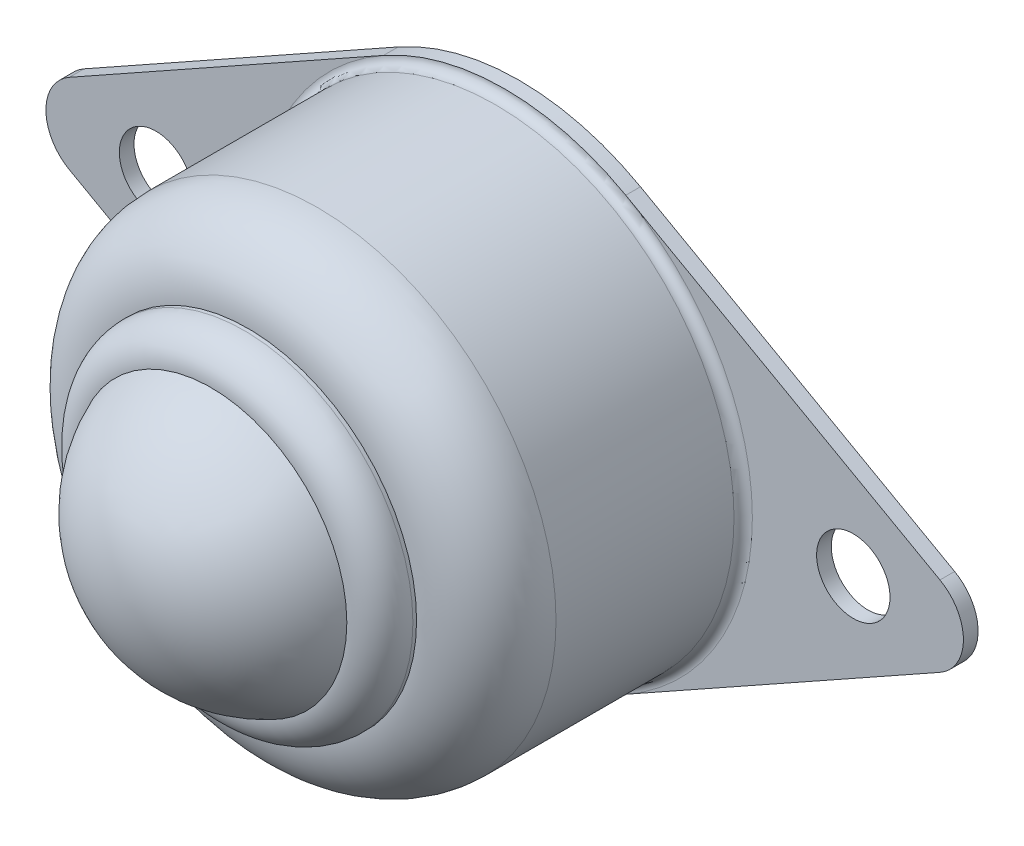
ISO-10303-21;
HEADER;
FILE_DESCRIPTION(('STEP AP214'),'2;1');
FILE_NAME('part.step','',(''),(''),'','','');
FILE_SCHEMA(('AUTOMOTIVE_DESIGN { 1 0 10303 214 1 1 1 1 }'));
ENDSEC;
DATA;
#1=APPLICATION_CONTEXT('core data for automotive mechanical design processes');
#2=APPLICATION_PROTOCOL_DEFINITION('international standard','automotive_design',2000,#1);
#3=PRODUCT_CONTEXT('',#1,'mechanical');
#4=PRODUCT('Part','Part','',(#3));
#5=PRODUCT_RELATED_PRODUCT_CATEGORY('part','',(#4));
#6=PRODUCT_DEFINITION_FORMATION('','',#4);
#7=PRODUCT_DEFINITION_CONTEXT('part definition',#1,'design');
#8=PRODUCT_DEFINITION('design','',#6,#7);
#9=PRODUCT_DEFINITION_SHAPE('','',#8);
#10=(LENGTH_UNIT() NAMED_UNIT(*) SI_UNIT(.MILLI.,.METRE.));
#11=(NAMED_UNIT(*) PLANE_ANGLE_UNIT() SI_UNIT($,.RADIAN.));
#12=(NAMED_UNIT(*) SI_UNIT($,.STERADIAN.) SOLID_ANGLE_UNIT());
#13=UNCERTAINTY_MEASURE_WITH_UNIT(LENGTH_MEASURE(1.E-05),#10,'distance_accuracy_value','');
#14=(GEOMETRIC_REPRESENTATION_CONTEXT(3) GLOBAL_UNCERTAINTY_ASSIGNED_CONTEXT((#13)) GLOBAL_UNIT_ASSIGNED_CONTEXT((#10,
#11,#12)) REPRESENTATION_CONTEXT('',''));
#15=CARTESIAN_POINT('',(0.,0.,0.));
#16=DIRECTION('',(0.,0.,1.));
#17=DIRECTION('',(1.,0.,0.));
#18=AXIS2_PLACEMENT_3D('',#15,#16,#17);
#19=CARTESIAN_POINT('',(0.,0.,1.3));
#20=DIRECTION('',(0.,0.,1.));
#21=DIRECTION('',(1.,0.,0.));
#22=AXIS2_PLACEMENT_3D('',#19,#20,#21);
#23=TOROIDAL_SURFACE('',#22,13.5,0.5);
#24=CARTESIAN_POINT('',(0.,0.,0.8));
#25=DIRECTION('',(0.,0.,1.));
#26=DIRECTION('',(1.,0.,0.));
#27=AXIS2_PLACEMENT_3D('',#24,#25,#26);
#28=CIRCLE('',#27,13.5);
#29=CARTESIAN_POINT('',(6.6,11.7766718558343,0.8));
#30=VERTEX_POINT('',#29);
#31=CARTESIAN_POINT('',(6.6,-11.7766718558343,0.8));
#32=VERTEX_POINT('',#31);
#33=EDGE_CURVE('E42',#30,#32,#28,.F.);
#34=ORIENTED_EDGE('',*,*,#33,.F.);
#35=CARTESIAN_POINT('',(0.,0.,0.8));
#36=DIRECTION('',(0.,0.,1.));
#37=DIRECTION('',(1.,0.,0.));
#38=AXIS2_PLACEMENT_3D('',#35,#36,#37);
#39=CIRCLE('',#38,13.5);
#40=CARTESIAN_POINT('',(-6.6,11.7766718558343,0.8));
#41=VERTEX_POINT('',#40);
#42=EDGE_CURVE('E113',#30,#41,#39,.T.);
#43=ORIENTED_EDGE('',*,*,#42,.T.);
#44=CARTESIAN_POINT('',(0.,0.,0.8));
#45=DIRECTION('',(0.,0.,1.));
#46=DIRECTION('',(1.,0.,0.));
#47=AXIS2_PLACEMENT_3D('',#44,#45,#46);
#48=CIRCLE('',#47,13.5);
#49=CARTESIAN_POINT('',(-6.60000000000001,-11.7766718558343,0.8));
#50=VERTEX_POINT('',#49);
#51=EDGE_CURVE('E118',#50,#41,#48,.F.);
#52=ORIENTED_EDGE('',*,*,#51,.F.);
#53=CARTESIAN_POINT('',(0.,0.,0.8));
#54=DIRECTION('',(0.,0.,1.));
#55=DIRECTION('',(1.,0.,0.));
#56=AXIS2_PLACEMENT_3D('',#53,#54,#55);
#57=CIRCLE('',#56,13.5);
#58=EDGE_CURVE('E115',#50,#32,#57,.T.);
#59=ORIENTED_EDGE('',*,*,#58,.T.);
#60=EDGE_LOOP('',(#34,#43,#52,#59));
#61=FACE_BOUND('',#60,.T.);
#62=CARTESIAN_POINT('',(0.,0.,1.3));
#63=DIRECTION('',(0.,0.,1.));
#64=DIRECTION('',(1.,0.,0.));
#65=AXIS2_PLACEMENT_3D('',#62,#63,#64);
#66=CIRCLE('',#65,13.);
#67=CARTESIAN_POINT('',(13.,0.,1.3));
#68=VERTEX_POINT('',#67);
#69=EDGE_CURVE('E11',#68,#68,#66,.T.);
#70=ORIENTED_EDGE('',*,*,#69,.F.);
#71=EDGE_LOOP('',(#70));
#72=FACE_BOUND('',#71,.T.);
#73=ADVANCED_FACE('F34',(#61,#72),#23,.F.);
#74=CARTESIAN_POINT('',(-22.5,0.,0.8));
#75=DIRECTION('',(0.,0.,1.));
#76=DIRECTION('',(1.,0.,0.));
#77=AXIS2_PLACEMENT_3D('',#74,#75,#76);
#78=PLANE('',#77);
#79=CARTESIAN_POINT('',(19.,0.,0.8));
#80=DIRECTION('',(0.,0.,1.));
#81=DIRECTION('',(1.,0.,0.));
#82=AXIS2_PLACEMENT_3D('',#79,#80,#81);
#83=CIRCLE('',#82,2.);
#84=CARTESIAN_POINT('',(21.,0.,0.799999999999999));
#85=VERTEX_POINT('',#84);
#86=EDGE_CURVE('E179',#85,#85,#83,.T.);
#87=ORIENTED_EDGE('',*,*,#86,.F.);
#88=EDGE_LOOP('',(#87));
#89=FACE_BOUND('',#88,.T.);
#90=DIRECTION('',(-0.872346063395134,0.488888888888889,0.));
#91=VECTOR('',#90,1.);
#92=CARTESIAN_POINT('',(23.7222222222222,2.18086515848784,0.8));
#93=LINE('',#92,#91);
#94=CARTESIAN_POINT('',(23.7222222222222,2.18086515848784,0.8));
#95=VERTEX_POINT('',#94);
#96=EDGE_CURVE('E120',#95,#30,#93,.T.);
#97=ORIENTED_EDGE('',*,*,#96,.T.);
#98=ORIENTED_EDGE('',*,*,#33,.T.);
#99=DIRECTION('',(0.872346063395134,0.488888888888889,0.));
#100=VECTOR('',#99,1.);
#101=CARTESIAN_POINT('',(23.7222222222222,-2.18086515848784,0.8));
#102=LINE('',#101,#100);
#103=CARTESIAN_POINT('',(23.7222222222222,-2.18086515848784,0.8));
#104=VERTEX_POINT('',#103);
#105=EDGE_CURVE('E200',#32,#104,#102,.T.);
#106=ORIENTED_EDGE('',*,*,#105,.T.);
#107=CARTESIAN_POINT('',(22.5,0.,0.8));
#108=DIRECTION('',(0.,0.,1.));
#109=DIRECTION('',(1.,0.,0.));
#110=AXIS2_PLACEMENT_3D('',#107,#108,#109);
#111=CIRCLE('',#110,2.5);
#112=EDGE_CURVE('E124',#104,#95,#111,.T.);
#113=ORIENTED_EDGE('',*,*,#112,.T.);
#114=EDGE_LOOP('',(#97,#98,#106,#113));
#115=FACE_BOUND('',#114,.T.);
#116=ADVANCED_FACE('F122',(#89,#115),#78,.T.);
#117=CARTESIAN_POINT('',(0.,0.,15.));
#118=DIRECTION('',(0.,0.,1.));
#119=DIRECTION('',(1.,0.,0.));
#120=AXIS2_PLACEMENT_3D('',#117,#118,#119);
#121=TOROIDAL_SURFACE('',#120,7.4,1.8);
#122=CARTESIAN_POINT('',(0.,0.,16.8));
#123=DIRECTION('',(0.,0.,1.));
#124=DIRECTION('',(1.,0.,0.));
#125=AXIS2_PLACEMENT_3D('',#122,#123,#124);
#126=CIRCLE('',#125,7.4);
#127=CARTESIAN_POINT('',(7.4,0.,16.8));
#128=VERTEX_POINT('',#127);
#129=EDGE_CURVE('E185',#128,#128,#126,.T.);
#130=ORIENTED_EDGE('',*,*,#129,.F.);
#131=EDGE_LOOP('',(#130));
#132=FACE_BOUND('',#131,.T.);
#133=CARTESIAN_POINT('',(0.,0.,15.));
#134=DIRECTION('',(0.,0.,1.));
#135=DIRECTION('',(1.,0.,0.));
#136=AXIS2_PLACEMENT_3D('',#133,#134,#135);
#137=CIRCLE('',#136,9.2);
#138=CARTESIAN_POINT('',(9.2,0.,15.));
#139=VERTEX_POINT('',#138);
#140=EDGE_CURVE('E186',#139,#139,#137,.F.);
#141=ORIENTED_EDGE('',*,*,#140,.F.);
#142=EDGE_LOOP('',(#141));
#143=FACE_BOUND('',#142,.T.);
#144=ADVANCED_FACE('F214',(#132,#143),#121,.T.);
#145=CARTESIAN_POINT('',(0.,0.,11.));
#146=DIRECTION('',(0.,0.,1.));
#147=DIRECTION('',(1.,0.,0.));
#148=AXIS2_PLACEMENT_3D('',#145,#146,#147);
#149=TOROIDAL_SURFACE('',#148,9.2,3.8);
#150=CARTESIAN_POINT('',(0.,0.,14.8));
#151=DIRECTION('',(0.,0.,1.));
#152=DIRECTION('',(1.,0.,0.));
#153=AXIS2_PLACEMENT_3D('',#150,#151,#152);
#154=CIRCLE('',#153,9.2);
#155=CARTESIAN_POINT('',(9.2,0.,14.8));
#156=VERTEX_POINT('',#155);
#157=EDGE_CURVE('E172',#156,#156,#154,.T.);
#158=ORIENTED_EDGE('',*,*,#157,.F.);
#159=EDGE_LOOP('',(#158));
#160=FACE_BOUND('',#159,.T.);
#161=CARTESIAN_POINT('',(0.,0.,11.));
#162=DIRECTION('',(0.,0.,1.));
#163=DIRECTION('',(1.,0.,0.));
#164=AXIS2_PLACEMENT_3D('',#161,#162,#163);
#165=CIRCLE('',#164,13.);
#166=CARTESIAN_POINT('',(13.,0.,11.));
#167=VERTEX_POINT('',#166);
#168=EDGE_CURVE('E182',#167,#167,#165,.F.);
#169=ORIENTED_EDGE('',*,*,#168,.F.);
#170=EDGE_LOOP('',(#169));
#171=FACE_BOUND('',#170,.T.);
#172=ADVANCED_FACE('F221',(#160,#171),#149,.T.);
#173=CARTESIAN_POINT('',(-22.5,0.,0.8));
#174=DIRECTION('',(0.,0.,-1.));
#175=DIRECTION('',(-1.,0.,0.));
#176=AXIS2_PLACEMENT_3D('',#173,#174,#175);
#177=CYLINDRICAL_SURFACE('',#176,2.5);
#178=CARTESIAN_POINT('',(-22.5,0.,0.));
#179=DIRECTION('',(0.,0.,1.));
#180=DIRECTION('',(1.,0.,0.));
#181=AXIS2_PLACEMENT_3D('',#178,#179,#180);
#182=CIRCLE('',#181,2.5);
#183=CARTESIAN_POINT('',(-23.7222222222222,2.18086515848784,0.));
#184=VERTEX_POINT('',#183);
#185=CARTESIAN_POINT('',(-23.7222222222222,-2.18086515848783,0.));
#186=VERTEX_POINT('',#185);
#187=EDGE_CURVE('E142',#184,#186,#182,.T.);
#188=ORIENTED_EDGE('',*,*,#187,.T.);
#189=DIRECTION('',(0.,0.,-1.));
#190=VECTOR('',#189,1.);
#191=CARTESIAN_POINT('',(-23.7222222222222,-2.18086515848783,0.8));
#192=LINE('',#191,#190);
#193=CARTESIAN_POINT('',(-23.7222222222222,-2.18086515848783,0.8));
#194=VERTEX_POINT('',#193);
#195=EDGE_CURVE('E170',#194,#186,#192,.T.);
#196=ORIENTED_EDGE('',*,*,#195,.F.);
#197=CARTESIAN_POINT('',(-22.5,0.,0.8));
#198=DIRECTION('',(0.,0.,1.));
#199=DIRECTION('',(1.,0.,0.));
#200=AXIS2_PLACEMENT_3D('',#197,#198,#199);
#201=CIRCLE('',#200,2.5);
#202=CARTESIAN_POINT('',(-23.7222222222222,2.18086515848784,0.8));
#203=VERTEX_POINT('',#202);
#204=EDGE_CURVE('E157',#203,#194,#201,.T.);
#205=ORIENTED_EDGE('',*,*,#204,.F.);
#206=DIRECTION('',(0.,0.,-1.));
#207=VECTOR('',#206,1.);
#208=CARTESIAN_POINT('',(-23.7222222222222,2.18086515848784,0.8));
#209=LINE('',#208,#207);
#210=EDGE_CURVE('E138',#203,#184,#209,.T.);
#211=ORIENTED_EDGE('',*,*,#210,.T.);
#212=EDGE_LOOP('',(#188,#196,#205,#211));
#213=FACE_BOUND('',#212,.T.);
#214=ADVANCED_FACE('F247',(#213),#177,.T.);
#215=CARTESIAN_POINT('',(-23.7222222222222,-2.18086515848783,0.8));
#216=DIRECTION('',(0.488888888888889,0.872346063395134,0.));
#217=DIRECTION('',(-0.872346063395134,0.488888888888889,0.));
#218=AXIS2_PLACEMENT_3D('',#215,#216,#217);
#219=PLANE('',#218);
#220=DIRECTION('',(0.872346063395134,-0.488888888888889,0.));
#221=VECTOR('',#220,1.);
#222=CARTESIAN_POINT('',(-23.7222222222222,-2.18086515848783,0.));
#223=LINE('',#222,#221);
#224=CARTESIAN_POINT('',(-6.60000000000001,-11.7766718558343,0.));
#225=VERTEX_POINT('',#224);
#226=EDGE_CURVE('E145',#186,#225,#223,.T.);
#227=ORIENTED_EDGE('',*,*,#226,.T.);
#228=DIRECTION('',(0.,0.,-1.));
#229=VECTOR('',#228,1.);
#230=CARTESIAN_POINT('',(-6.60000000000001,-11.7766718558343,0.8));
#231=LINE('',#230,#229);
#232=EDGE_CURVE('E167',#50,#225,#231,.T.);
#233=ORIENTED_EDGE('',*,*,#232,.F.);
#234=DIRECTION('',(0.872346063395134,-0.488888888888889,0.));
#235=VECTOR('',#234,1.);
#236=CARTESIAN_POINT('',(-23.7222222222222,-2.18086515848783,0.8));
#237=LINE('',#236,#235);
#238=EDGE_CURVE('E94',#194,#50,#237,.T.);
#239=ORIENTED_EDGE('',*,*,#238,.F.);
#240=ORIENTED_EDGE('',*,*,#195,.T.);
#241=EDGE_LOOP('',(#227,#233,#239,#240));
#242=FACE_BOUND('',#241,.T.);
#243=ADVANCED_FACE('F195',(#242),#219,.F.);
#244=CARTESIAN_POINT('',(0.,0.,0.8));
#245=DIRECTION('',(0.,0.,-1.));
#246=DIRECTION('',(-1.,0.,0.));
#247=AXIS2_PLACEMENT_3D('',#244,#245,#246);
#248=CYLINDRICAL_SURFACE('',#247,13.5);
#249=CARTESIAN_POINT('',(0.,0.,0.));
#250=DIRECTION('',(0.,0.,1.));
#251=DIRECTION('',(1.,0.,0.));
#252=AXIS2_PLACEMENT_3D('',#249,#250,#251);
#253=CIRCLE('',#252,13.5);
#254=CARTESIAN_POINT('',(6.6,-11.7766718558343,0.));
#255=VERTEX_POINT('',#254);
#256=EDGE_CURVE('E148',#225,#255,#253,.T.);
#257=ORIENTED_EDGE('',*,*,#256,.T.);
#258=DIRECTION('',(0.,0.,-1.));
#259=VECTOR('',#258,1.);
#260=CARTESIAN_POINT('',(6.6,-11.7766718558343,0.8));
#261=LINE('',#260,#259);
#262=EDGE_CURVE('E164',#32,#255,#261,.T.);
#263=ORIENTED_EDGE('',*,*,#262,.F.);
#264=ORIENTED_EDGE('',*,*,#58,.F.);
#265=ORIENTED_EDGE('',*,*,#232,.T.);
#266=EDGE_LOOP('',(#257,#263,#264,#265));
#267=FACE_BOUND('',#266,.T.);
#268=ADVANCED_FACE('F198',(#267),#248,.T.);
#269=CARTESIAN_POINT('',(23.7222222222222,-2.18086515848784,0.8));
#270=DIRECTION('',(-0.488888888888889,0.872346063395134,0.));
#271=DIRECTION('',(-0.872346063395134,-0.488888888888889,0.));
#272=AXIS2_PLACEMENT_3D('',#269,#270,#271);
#273=PLANE('',#272);
#274=DIRECTION('',(0.872346063395134,0.488888888888889,0.));
#275=VECTOR('',#274,1.);
#276=CARTESIAN_POINT('',(23.7222222222222,-2.18086515848784,0.));
#277=LINE('',#276,#275);
#278=CARTESIAN_POINT('',(23.7222222222222,-2.18086515848784,0.));
#279=VERTEX_POINT('',#278);
#280=EDGE_CURVE('E150',#255,#279,#277,.T.);
#281=ORIENTED_EDGE('',*,*,#280,.T.);
#282=DIRECTION('',(0.,0.,-1.));
#283=VECTOR('',#282,1.);
#284=CARTESIAN_POINT('',(23.7222222222222,-2.18086515848784,0.8));
#285=LINE('',#284,#283);
#286=EDGE_CURVE('E161',#104,#279,#285,.T.);
#287=ORIENTED_EDGE('',*,*,#286,.F.);
#288=ORIENTED_EDGE('',*,*,#105,.F.);
#289=ORIENTED_EDGE('',*,*,#262,.T.);
#290=EDGE_LOOP('',(#281,#287,#288,#289));
#291=FACE_BOUND('',#290,.T.);
#292=ADVANCED_FACE('F365',(#291),#273,.F.);
#293=CARTESIAN_POINT('',(22.5,0.,0.8));
#294=DIRECTION('',(0.,0.,-1.));
#295=DIRECTION('',(-1.,0.,0.));
#296=AXIS2_PLACEMENT_3D('',#293,#294,#295);
#297=CYLINDRICAL_SURFACE('',#296,2.5);
#298=CARTESIAN_POINT('',(22.5,0.,0.));
#299=DIRECTION('',(0.,0.,1.));
#300=DIRECTION('',(1.,0.,0.));
#301=AXIS2_PLACEMENT_3D('',#298,#299,#300);
#302=CIRCLE('',#301,2.5);
#303=CARTESIAN_POINT('',(23.7222222222222,2.18086515848784,0.));
#304=VERTEX_POINT('',#303);
#305=EDGE_CURVE('E152',#279,#304,#302,.T.);
#306=ORIENTED_EDGE('',*,*,#305,.T.);
#307=DIRECTION('',(0.,0.,-1.));
#308=VECTOR('',#307,1.);
#309=CARTESIAN_POINT('',(23.7222222222222,2.18086515848784,0.8));
#310=LINE('',#309,#308);
#311=EDGE_CURVE('E133',#95,#304,#310,.T.);
#312=ORIENTED_EDGE('',*,*,#311,.F.);
#313=ORIENTED_EDGE('',*,*,#112,.F.);
#314=ORIENTED_EDGE('',*,*,#286,.T.);
#315=EDGE_LOOP('',(#306,#312,#313,#314));
#316=FACE_BOUND('',#315,.T.);
#317=ADVANCED_FACE('F357',(#316),#297,.T.);
#318=CARTESIAN_POINT('',(23.7222222222222,2.18086515848784,0.8));
#319=DIRECTION('',(-0.488888888888889,-0.872346063395134,0.));
#320=DIRECTION('',(0.872346063395134,-0.488888888888889,0.));
#321=AXIS2_PLACEMENT_3D('',#318,#319,#320);
#322=PLANE('',#321);
#323=DIRECTION('',(-0.872346063395134,0.488888888888889,0.));
#324=VECTOR('',#323,1.);
#325=CARTESIAN_POINT('',(23.7222222222222,2.18086515848784,0.));
#326=LINE('',#325,#324);
#327=CARTESIAN_POINT('',(6.6,11.7766718558343,0.));
#328=VERTEX_POINT('',#327);
#329=EDGE_CURVE('E132',#304,#328,#326,.T.);
#330=ORIENTED_EDGE('',*,*,#329,.T.);
#331=DIRECTION('',(0.,0.,-1.));
#332=VECTOR('',#331,1.);
#333=CARTESIAN_POINT('',(6.6,11.7766718558343,0.8));
#334=LINE('',#333,#332);
#335=EDGE_CURVE('E129',#30,#328,#334,.T.);
#336=ORIENTED_EDGE('',*,*,#335,.F.);
#337=ORIENTED_EDGE('',*,*,#96,.F.);
#338=ORIENTED_EDGE('',*,*,#311,.T.);
#339=EDGE_LOOP('',(#330,#336,#337,#338));
#340=FACE_BOUND('',#339,.T.);
#341=ADVANCED_FACE('F130',(#340),#322,.F.);
#342=CARTESIAN_POINT('',(0.,0.,0.8));
#343=DIRECTION('',(0.,0.,-1.));
#344=DIRECTION('',(-1.,0.,0.));
#345=AXIS2_PLACEMENT_3D('',#342,#343,#344);
#346=CYLINDRICAL_SURFACE('',#345,13.5);
#347=CARTESIAN_POINT('',(0.,0.,0.));
#348=DIRECTION('',(0.,0.,1.));
#349=DIRECTION('',(1.,0.,0.));
#350=AXIS2_PLACEMENT_3D('',#347,#348,#349);
#351=CIRCLE('',#350,13.5);
#352=CARTESIAN_POINT('',(-6.6,11.7766718558343,0.));
#353=VERTEX_POINT('',#352);
#354=EDGE_CURVE('E79',#328,#353,#351,.T.);
#355=ORIENTED_EDGE('',*,*,#354,.T.);
#356=DIRECTION('',(0.,0.,-1.));
#357=VECTOR('',#356,1.);
#358=CARTESIAN_POINT('',(-6.6,11.7766718558343,0.8));
#359=LINE('',#358,#357);
#360=EDGE_CURVE('E134',#41,#353,#359,.T.);
#361=ORIENTED_EDGE('',*,*,#360,.F.);
#362=ORIENTED_EDGE('',*,*,#42,.F.);
#363=ORIENTED_EDGE('',*,*,#335,.T.);
#364=EDGE_LOOP('',(#355,#361,#362,#363));
#365=FACE_BOUND('',#364,.T.);
#366=ADVANCED_FACE('F136',(#365),#346,.T.);
#367=CARTESIAN_POINT('',(-23.7222222222222,2.18086515848784,0.8));
#368=DIRECTION('',(0.488888888888889,-0.872346063395134,0.));
#369=DIRECTION('',(0.872346063395134,0.488888888888889,0.));
#370=AXIS2_PLACEMENT_3D('',#367,#368,#369);
#371=PLANE('',#370);
#372=DIRECTION('',(-0.872346063395134,-0.488888888888889,0.));
#373=VECTOR('',#372,1.);
#374=CARTESIAN_POINT('',(-23.7222222222222,2.18086515848784,0.));
#375=LINE('',#374,#373);
#376=EDGE_CURVE('E85',#353,#184,#375,.T.);
#377=ORIENTED_EDGE('',*,*,#376,.T.);
#378=ORIENTED_EDGE('',*,*,#210,.F.);
#379=DIRECTION('',(-0.872346063395134,-0.488888888888889,0.));
#380=VECTOR('',#379,1.);
#381=CARTESIAN_POINT('',(-23.7222222222222,2.18086515848784,0.8));
#382=LINE('',#381,#380);
#383=EDGE_CURVE('E50',#41,#203,#382,.T.);
#384=ORIENTED_EDGE('',*,*,#383,.F.);
#385=ORIENTED_EDGE('',*,*,#360,.T.);
#386=EDGE_LOOP('',(#377,#378,#384,#385));
#387=FACE_BOUND('',#386,.T.);
#388=ADVANCED_FACE('F228',(#387),#371,.F.);
#389=CARTESIAN_POINT('',(-19.,0.,0.8));
#390=DIRECTION('',(0.,0.,1.));
#391=DIRECTION('',(1.,0.,0.));
#392=AXIS2_PLACEMENT_3D('',#389,#390,#391);
#393=CIRCLE('',#392,2.);
#394=CARTESIAN_POINT('',(-17.,0.,0.799999999999999));
#395=VERTEX_POINT('',#394);
#396=EDGE_CURVE('E175',#395,#395,#393,.T.);
#397=ORIENTED_EDGE('',*,*,#396,.F.);
#398=EDGE_LOOP('',(#397));
#399=FACE_BOUND('',#398,.T.);
#400=ORIENTED_EDGE('',*,*,#238,.T.);
#401=ORIENTED_EDGE('',*,*,#51,.T.);
#402=ORIENTED_EDGE('',*,*,#383,.T.);
#403=ORIENTED_EDGE('',*,*,#204,.T.);
#404=EDGE_LOOP('',(#400,#401,#402,#403));
#405=FACE_BOUND('',#404,.T.);
#406=ADVANCED_FACE('F191',(#399,#405),#78,.T.);
#407=CARTESIAN_POINT('',(-22.5,0.,0.));
#408=DIRECTION('',(0.,0.,1.));
#409=DIRECTION('',(1.,0.,0.));
#410=AXIS2_PLACEMENT_3D('',#407,#408,#409);
#411=PLANE('',#410);
#412=CARTESIAN_POINT('',(19.,0.,0.));
#413=DIRECTION('',(0.,0.,1.));
#414=DIRECTION('',(1.,0.,0.));
#415=AXIS2_PLACEMENT_3D('',#412,#413,#414);
#416=CIRCLE('',#415,2.);
#417=CARTESIAN_POINT('',(21.,0.,0.));
#418=VERTEX_POINT('',#417);
#419=EDGE_CURVE('E176',#418,#418,#416,.T.);
#420=ORIENTED_EDGE('',*,*,#419,.T.);
#421=EDGE_LOOP('',(#420));
#422=FACE_BOUND('',#421,.T.);
#423=CARTESIAN_POINT('',(-19.,0.,0.));
#424=DIRECTION('',(0.,0.,1.));
#425=DIRECTION('',(1.,0.,0.));
#426=AXIS2_PLACEMENT_3D('',#423,#424,#425);
#427=CIRCLE('',#426,2.);
#428=CARTESIAN_POINT('',(-17.,0.,0.));
#429=VERTEX_POINT('',#428);
#430=EDGE_CURVE('E146',#429,#429,#427,.T.);
#431=ORIENTED_EDGE('',*,*,#430,.T.);
#432=EDGE_LOOP('',(#431));
#433=FACE_BOUND('',#432,.T.);
#434=ORIENTED_EDGE('',*,*,#187,.F.);
#435=ORIENTED_EDGE('',*,*,#376,.F.);
#436=ORIENTED_EDGE('',*,*,#354,.F.);
#437=ORIENTED_EDGE('',*,*,#329,.F.);
#438=ORIENTED_EDGE('',*,*,#305,.F.);
#439=ORIENTED_EDGE('',*,*,#280,.F.);
#440=ORIENTED_EDGE('',*,*,#256,.F.);
#441=ORIENTED_EDGE('',*,*,#226,.F.);
#442=EDGE_LOOP('',(#434,#435,#436,#437,#438,#439,#440,#441));
#443=FACE_BOUND('',#442,.T.);
#444=ADVANCED_FACE('F227',(#422,#433,#443),#411,.F.);
#445=CARTESIAN_POINT('',(-19.,0.,-10.));
#446=DIRECTION('',(0.,0.,1.));
#447=DIRECTION('',(1.,0.,0.));
#448=AXIS2_PLACEMENT_3D('',#445,#446,#447);
#449=CYLINDRICAL_SURFACE('',#448,2.);
#450=CARTESIAN_POINT('',(-17.,0.,0.799999999999999));
#451=CARTESIAN_POINT('',(-17.,0.,0.791666666666665));
#452=CARTESIAN_POINT('',(-17.,0.,0.783333333333332));
#453=CARTESIAN_POINT('',(-17.,0.,0.766666666666665));
#454=CARTESIAN_POINT('',(-17.,0.,0.758333333333332));
#455=CARTESIAN_POINT('',(-17.,0.,0.741666666666665));
#456=CARTESIAN_POINT('',(-17.,0.,0.733333333333332));
#457=CARTESIAN_POINT('',(-17.,0.,0.716666666666665));
#458=CARTESIAN_POINT('',(-17.,0.,0.708333333333332));
#459=CARTESIAN_POINT('',(-17.,0.,0.691666666666666));
#460=CARTESIAN_POINT('',(-17.,0.,0.683333333333332));
#461=CARTESIAN_POINT('',(-17.,0.,0.666666666666666));
#462=CARTESIAN_POINT('',(-17.,0.,0.658333333333333));
#463=CARTESIAN_POINT('',(-17.,0.,0.641666666666666));
#464=CARTESIAN_POINT('',(-17.,0.,0.633333333333332));
#465=CARTESIAN_POINT('',(-17.,0.,0.616666666666666));
#466=CARTESIAN_POINT('',(-17.,0.,0.608333333333333));
#467=CARTESIAN_POINT('',(-17.,0.,0.591666666666666));
#468=CARTESIAN_POINT('',(-17.,0.,0.583333333333333));
#469=CARTESIAN_POINT('',(-17.,0.,0.566666666666666));
#470=CARTESIAN_POINT('',(-17.,0.,0.558333333333332));
#471=CARTESIAN_POINT('',(-17.,0.,0.541666666666665));
#472=CARTESIAN_POINT('',(-17.,0.,0.533333333333332));
#473=CARTESIAN_POINT('',(-17.,0.,0.516666666666666));
#474=CARTESIAN_POINT('',(-17.,0.,0.508333333333332));
#475=CARTESIAN_POINT('',(-17.,0.,0.491666666666666));
#476=CARTESIAN_POINT('',(-17.,0.,0.483333333333333));
#477=CARTESIAN_POINT('',(-17.,0.,0.466666666666666));
#478=CARTESIAN_POINT('',(-17.,0.,0.458333333333333));
#479=CARTESIAN_POINT('',(-17.,0.,0.441666666666666));
#480=CARTESIAN_POINT('',(-17.,0.,0.433333333333333));
#481=CARTESIAN_POINT('',(-17.,0.,0.416666666666666));
#482=CARTESIAN_POINT('',(-17.,0.,0.408333333333333));
#483=CARTESIAN_POINT('',(-17.,0.,0.391666666666666));
#484=CARTESIAN_POINT('',(-17.,0.,0.383333333333332));
#485=CARTESIAN_POINT('',(-17.,0.,0.366666666666666));
#486=CARTESIAN_POINT('',(-17.,0.,0.358333333333333));
#487=CARTESIAN_POINT('',(-17.,0.,0.341666666666666));
#488=CARTESIAN_POINT('',(-17.,0.,0.333333333333332));
#489=CARTESIAN_POINT('',(-17.,0.,0.316666666666666));
#490=CARTESIAN_POINT('',(-17.,0.,0.308333333333333));
#491=CARTESIAN_POINT('',(-17.,0.,0.291666666666666));
#492=CARTESIAN_POINT('',(-17.,0.,0.283333333333333));
#493=CARTESIAN_POINT('',(-17.,0.,0.266666666666666));
#494=CARTESIAN_POINT('',(-17.,0.,0.258333333333333));
#495=CARTESIAN_POINT('',(-17.,0.,0.241666666666667));
#496=CARTESIAN_POINT('',(-17.,0.,0.233333333333333));
#497=CARTESIAN_POINT('',(-17.,0.,0.216666666666666));
#498=CARTESIAN_POINT('',(-17.,0.,0.208333333333332));
#499=CARTESIAN_POINT('',(-17.,0.,0.191666666666666));
#500=CARTESIAN_POINT('',(-17.,0.,0.183333333333333));
#501=CARTESIAN_POINT('',(-17.,0.,0.166666666666666));
#502=CARTESIAN_POINT('',(-17.,0.,0.158333333333333));
#503=CARTESIAN_POINT('',(-17.,0.,0.141666666666666));
#504=CARTESIAN_POINT('',(-17.,0.,0.133333333333333));
#505=CARTESIAN_POINT('',(-17.,0.,0.116666666666667));
#506=CARTESIAN_POINT('',(-17.,0.,0.108333333333333));
#507=CARTESIAN_POINT('',(-17.,0.,0.0916666666666664));
#508=CARTESIAN_POINT('',(-17.,0.,0.0833333333333334));
#509=CARTESIAN_POINT('',(-17.,0.,0.0666666666666668));
#510=CARTESIAN_POINT('',(-17.,0.,0.0583333333333333));
#511=CARTESIAN_POINT('',(-17.,0.,0.0416666666666667));
#512=CARTESIAN_POINT('',(-17.,0.,0.0333333333333337));
#513=CARTESIAN_POINT('',(-17.,0.,0.0166666666666671));
#514=CARTESIAN_POINT('',(-17.,0.,0.00833333333333357));
#515=CARTESIAN_POINT('',(-17.,0.,0.));
#516=B_SPLINE_CURVE_WITH_KNOTS('',3,(#450,#451,#452,#453,#454,#455,#456,#457,#458,#459,#460,
#461,#462,#463,#464,#465,#466,#467,#468,#469,#470,#471,#472,#473,#474,#475,#476,#477,#478,#479,
#480,#481,#482,#483,#484,#485,#486,#487,#488,#489,#490,#491,#492,#493,#494,#495,#496,#497,#498,
#499,#500,#501,#502,#503,#504,#505,#506,#507,#508,#509,#510,#511,#512,#513,#514,#515),
.UNSPECIFIED.,.F.,.F.,(4,2,2,2,2,2,2,2,2,2,2,2,2,2,2,2,2,2,2,2,2,2,2,2,2,2,2,2,2,2,2,2,4),(0.,
0.0250000000000007,0.0499999999999997,0.0750000000000004,0.0999999999999994,0.125,
0.149999999999999,0.175,0.199999999999999,0.225,0.25,0.274999999999999,0.3,0.324999999999999,
0.35,0.374999999999999,0.399999999999999,0.425,0.449999999999999,0.475,0.499999999999999,
0.524999999999999,0.549999999999998,0.574999999999999,0.6,0.624999999999999,0.65,
0.674999999999998,0.699999999999999,0.724999999999998,0.749999999999999,0.774999999999998,
0.799999999999999),.UNSPECIFIED.);
#517=EDGE_CURVE('BSEAM234',#395,#429,#516,.T.);
#518=ORIENTED_EDGE('',*,*,#396,.T.);
#519=ORIENTED_EDGE('',*,*,#430,.F.);
#520=ORIENTED_EDGE('',*,*,#517,.T.);
#521=ORIENTED_EDGE('',*,*,#517,.F.);
#522=EDGE_LOOP('',(#518,#520,#519,#521));
#523=FACE_BOUND('',#522,.T.);
#524=ADVANCED_FACE('F234',(#523),#449,.F.);
#525=CARTESIAN_POINT('',(19.,0.,-10.));
#526=DIRECTION('',(0.,0.,1.));
#527=DIRECTION('',(1.,0.,0.));
#528=AXIS2_PLACEMENT_3D('',#525,#526,#527);
#529=CYLINDRICAL_SURFACE('',#528,2.);
#530=CARTESIAN_POINT('',(21.,0.,0.799999999999999));
#531=CARTESIAN_POINT('',(21.,0.,0.791666666666665));
#532=CARTESIAN_POINT('',(21.,0.,0.783333333333332));
#533=CARTESIAN_POINT('',(21.,0.,0.766666666666665));
#534=CARTESIAN_POINT('',(21.,0.,0.758333333333332));
#535=CARTESIAN_POINT('',(21.,0.,0.741666666666665));
#536=CARTESIAN_POINT('',(21.,0.,0.733333333333332));
#537=CARTESIAN_POINT('',(21.,0.,0.716666666666665));
#538=CARTESIAN_POINT('',(21.,0.,0.708333333333332));
#539=CARTESIAN_POINT('',(21.,0.,0.691666666666666));
#540=CARTESIAN_POINT('',(21.,0.,0.683333333333332));
#541=CARTESIAN_POINT('',(21.,0.,0.666666666666666));
#542=CARTESIAN_POINT('',(21.,0.,0.658333333333333));
#543=CARTESIAN_POINT('',(21.,0.,0.641666666666666));
#544=CARTESIAN_POINT('',(21.,0.,0.633333333333332));
#545=CARTESIAN_POINT('',(21.,0.,0.616666666666666));
#546=CARTESIAN_POINT('',(21.,0.,0.608333333333333));
#547=CARTESIAN_POINT('',(21.,0.,0.591666666666666));
#548=CARTESIAN_POINT('',(21.,0.,0.583333333333333));
#549=CARTESIAN_POINT('',(21.,0.,0.566666666666666));
#550=CARTESIAN_POINT('',(21.,0.,0.558333333333332));
#551=CARTESIAN_POINT('',(21.,0.,0.541666666666665));
#552=CARTESIAN_POINT('',(21.,0.,0.533333333333332));
#553=CARTESIAN_POINT('',(21.,0.,0.516666666666666));
#554=CARTESIAN_POINT('',(21.,0.,0.508333333333332));
#555=CARTESIAN_POINT('',(21.,0.,0.491666666666666));
#556=CARTESIAN_POINT('',(21.,0.,0.483333333333333));
#557=CARTESIAN_POINT('',(21.,0.,0.466666666666666));
#558=CARTESIAN_POINT('',(21.,0.,0.458333333333333));
#559=CARTESIAN_POINT('',(21.,0.,0.441666666666666));
#560=CARTESIAN_POINT('',(21.,0.,0.433333333333333));
#561=CARTESIAN_POINT('',(21.,0.,0.416666666666666));
#562=CARTESIAN_POINT('',(21.,0.,0.408333333333333));
#563=CARTESIAN_POINT('',(21.,0.,0.391666666666666));
#564=CARTESIAN_POINT('',(21.,0.,0.383333333333332));
#565=CARTESIAN_POINT('',(21.,0.,0.366666666666666));
#566=CARTESIAN_POINT('',(21.,0.,0.358333333333333));
#567=CARTESIAN_POINT('',(21.,0.,0.341666666666666));
#568=CARTESIAN_POINT('',(21.,0.,0.333333333333332));
#569=CARTESIAN_POINT('',(21.,0.,0.316666666666666));
#570=CARTESIAN_POINT('',(21.,0.,0.308333333333333));
#571=CARTESIAN_POINT('',(21.,0.,0.291666666666666));
#572=CARTESIAN_POINT('',(21.,0.,0.283333333333333));
#573=CARTESIAN_POINT('',(21.,0.,0.266666666666666));
#574=CARTESIAN_POINT('',(21.,0.,0.258333333333333));
#575=CARTESIAN_POINT('',(21.,0.,0.241666666666667));
#576=CARTESIAN_POINT('',(21.,0.,0.233333333333333));
#577=CARTESIAN_POINT('',(21.,0.,0.216666666666666));
#578=CARTESIAN_POINT('',(21.,0.,0.208333333333332));
#579=CARTESIAN_POINT('',(21.,0.,0.191666666666666));
#580=CARTESIAN_POINT('',(21.,0.,0.183333333333333));
#581=CARTESIAN_POINT('',(21.,0.,0.166666666666666));
#582=CARTESIAN_POINT('',(21.,0.,0.158333333333333));
#583=CARTESIAN_POINT('',(21.,0.,0.141666666666666));
#584=CARTESIAN_POINT('',(21.,0.,0.133333333333333));
#585=CARTESIAN_POINT('',(21.,0.,0.116666666666667));
#586=CARTESIAN_POINT('',(21.,0.,0.108333333333333));
#587=CARTESIAN_POINT('',(21.,0.,0.0916666666666664));
#588=CARTESIAN_POINT('',(21.,0.,0.0833333333333334));
#589=CARTESIAN_POINT('',(21.,0.,0.0666666666666668));
#590=CARTESIAN_POINT('',(21.,0.,0.0583333333333333));
#591=CARTESIAN_POINT('',(21.,0.,0.0416666666666667));
#592=CARTESIAN_POINT('',(21.,0.,0.0333333333333337));
#593=CARTESIAN_POINT('',(21.,0.,0.0166666666666671));
#594=CARTESIAN_POINT('',(21.,0.,0.00833333333333357));
#595=CARTESIAN_POINT('',(21.,0.,0.));
#596=B_SPLINE_CURVE_WITH_KNOTS('',3,(#530,#531,#532,#533,#534,#535,#536,#537,#538,#539,#540,
#541,#542,#543,#544,#545,#546,#547,#548,#549,#550,#551,#552,#553,#554,#555,#556,#557,#558,#559,
#560,#561,#562,#563,#564,#565,#566,#567,#568,#569,#570,#571,#572,#573,#574,#575,#576,#577,#578,
#579,#580,#581,#582,#583,#584,#585,#586,#587,#588,#589,#590,#591,#592,#593,#594,#595),
.UNSPECIFIED.,.F.,.F.,(4,2,2,2,2,2,2,2,2,2,2,2,2,2,2,2,2,2,2,2,2,2,2,2,2,2,2,2,2,2,2,2,4),(0.,
0.0250000000000007,0.0499999999999997,0.0750000000000004,0.0999999999999994,0.125,
0.149999999999999,0.175,0.199999999999999,0.225,0.25,0.274999999999999,0.3,0.324999999999999,
0.35,0.374999999999999,0.399999999999999,0.425,0.449999999999999,0.475,0.499999999999999,
0.524999999999999,0.549999999999998,0.574999999999999,0.6,0.624999999999999,0.65,
0.674999999999998,0.699999999999999,0.724999999999998,0.749999999999999,0.774999999999998,
0.799999999999999),.UNSPECIFIED.);
#597=EDGE_CURVE('BSEAM210',#85,#418,#596,.T.);
#598=ORIENTED_EDGE('',*,*,#86,.T.);
#599=ORIENTED_EDGE('',*,*,#419,.F.);
#600=ORIENTED_EDGE('',*,*,#597,.T.);
#601=ORIENTED_EDGE('',*,*,#597,.F.);
#602=EDGE_LOOP('',(#598,#600,#599,#601));
#603=FACE_BOUND('',#602,.T.);
#604=ADVANCED_FACE('F210',(#603),#529,.F.);
#605=CARTESIAN_POINT('',(0.,0.,14.8));
#606=DIRECTION('',(0.,0.,-1.));
#607=DIRECTION('',(-1.,0.,0.));
#608=AXIS2_PLACEMENT_3D('',#605,#606,#607);
#609=CYLINDRICAL_SURFACE('',#608,13.);
#610=ORIENTED_EDGE('',*,*,#69,.T.);
#611=EDGE_LOOP('',(#610));
#612=FACE_BOUND('',#611,.T.);
#613=ORIENTED_EDGE('',*,*,#168,.T.);
#614=EDGE_LOOP('',(#613));
#615=FACE_BOUND('',#614,.T.);
#616=ADVANCED_FACE('F266',(#612,#615),#609,.T.);
#617=CARTESIAN_POINT('',(0.,0.,16.8));
#618=DIRECTION('',(0.,0.,-1.));
#619=DIRECTION('',(-1.,0.,0.));
#620=AXIS2_PLACEMENT_3D('',#617,#618,#619);
#621=CYLINDRICAL_SURFACE('',#620,9.2);
#622=ORIENTED_EDGE('',*,*,#140,.T.);
#623=EDGE_LOOP('',(#622));
#624=FACE_BOUND('',#623,.T.);
#625=ORIENTED_EDGE('',*,*,#157,.T.);
#626=EDGE_LOOP('',(#625));
#627=FACE_BOUND('',#626,.T.);
#628=ADVANCED_FACE('F260',(#624,#627),#621,.T.);
#629=CARTESIAN_POINT('',(0.,0.,13.824));
#630=DIRECTION('',(0.,0.,1.));
#631=DIRECTION('',(1.,0.,0.));
#632=AXIS2_PLACEMENT_3D('',#629,#630,#631);
#633=SPHERICAL_SURFACE('',#632,7.976);
#634=ORIENTED_EDGE('',*,*,#129,.T.);
#635=EDGE_LOOP('',(#634));
#636=FACE_BOUND('',#635,.T.);
#637=ADVANCED_FACE('F258',(#636),#633,.T.);
#638=CLOSED_SHELL('',(#73,#116,#144,#172,#214,#243,#268,#292,#317,#341,#366,#388,#406,#444,#524,
#604,#616,#628,#637));
#639=MANIFOLD_SOLID_BREP('B2',#638);
#640=ADVANCED_BREP_SHAPE_REPRESENTATION('',(#18,#639),#14);
#641=SHAPE_DEFINITION_REPRESENTATION(#9,#640);
ENDSEC;
END-ISO-10303-21;
